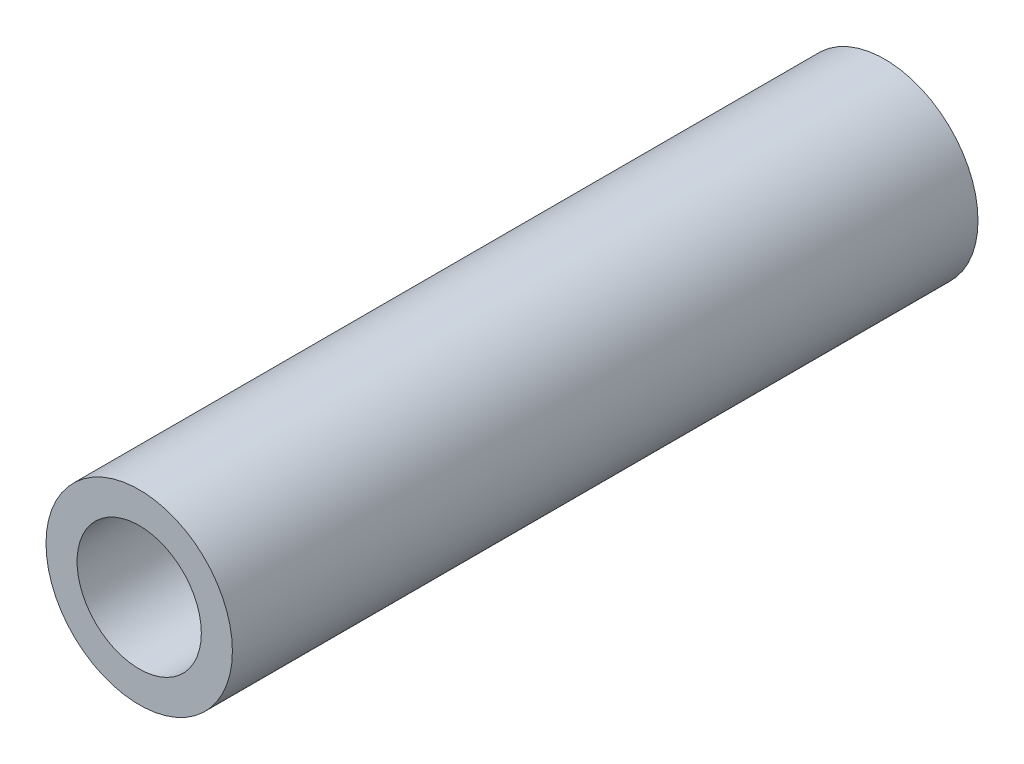
ISO-10303-21;
HEADER;
FILE_DESCRIPTION(('STEP AP214'),'2;1');
FILE_NAME('part.step','',(''),(''),'','','');
FILE_SCHEMA(('AUTOMOTIVE_DESIGN { 1 0 10303 214 1 1 1 1 }'));
ENDSEC;
DATA;
#1=APPLICATION_CONTEXT('core data for automotive mechanical design processes');
#2=APPLICATION_PROTOCOL_DEFINITION('international standard','automotive_design',2000,#1);
#3=PRODUCT_CONTEXT('',#1,'mechanical');
#4=PRODUCT('Part','Part','',(#3));
#5=PRODUCT_RELATED_PRODUCT_CATEGORY('part','',(#4));
#6=PRODUCT_DEFINITION_FORMATION('','',#4);
#7=PRODUCT_DEFINITION_CONTEXT('part definition',#1,'design');
#8=PRODUCT_DEFINITION('design','',#6,#7);
#9=PRODUCT_DEFINITION_SHAPE('','',#8);
#10=(LENGTH_UNIT() NAMED_UNIT(*) SI_UNIT(.MILLI.,.METRE.));
#11=(NAMED_UNIT(*) PLANE_ANGLE_UNIT() SI_UNIT($,.RADIAN.));
#12=(NAMED_UNIT(*) SI_UNIT($,.STERADIAN.) SOLID_ANGLE_UNIT());
#13=UNCERTAINTY_MEASURE_WITH_UNIT(LENGTH_MEASURE(1.E-05),#10,'distance_accuracy_value','');
#14=(GEOMETRIC_REPRESENTATION_CONTEXT(3) GLOBAL_UNCERTAINTY_ASSIGNED_CONTEXT((#13)) GLOBAL_UNIT_ASSIGNED_CONTEXT((#10,
#11,#12)) REPRESENTATION_CONTEXT('',''));
#15=CARTESIAN_POINT('',(0.,0.,0.));
#16=DIRECTION('',(0.,0.,1.));
#17=DIRECTION('',(1.,0.,0.));
#18=AXIS2_PLACEMENT_3D('',#15,#16,#17);
#19=CARTESIAN_POINT('',(0.,0.,24.));
#20=DIRECTION('',(0.,0.,1.));
#21=DIRECTION('',(1.,0.,0.));
#22=AXIS2_PLACEMENT_3D('',#19,#20,#21);
#23=PLANE('',#22);
#24=CARTESIAN_POINT('',(0.,0.,24.));
#25=DIRECTION('',(0.,0.,1.));
#26=DIRECTION('',(1.,0.,0.));
#27=AXIS2_PLACEMENT_3D('',#24,#25,#26);
#28=CIRCLE('',#27,3.);
#29=CARTESIAN_POINT('',(3.,0.,24.));
#30=VERTEX_POINT('',#29);
#31=EDGE_CURVE('E10',#30,#30,#28,.T.);
#32=ORIENTED_EDGE('',*,*,#31,.T.);
#33=EDGE_LOOP('',(#32));
#34=FACE_BOUND('',#33,.T.);
#35=CARTESIAN_POINT('',(0.,0.,24.));
#36=DIRECTION('',(0.,0.,1.));
#37=DIRECTION('',(1.,0.,0.));
#38=AXIS2_PLACEMENT_3D('',#35,#36,#37);
#39=CIRCLE('',#38,2.);
#40=CARTESIAN_POINT('',(2.,0.,24.));
#41=VERTEX_POINT('',#40);
#42=EDGE_CURVE('E41',#41,#41,#39,.T.);
#43=ORIENTED_EDGE('',*,*,#42,.F.);
#44=EDGE_LOOP('',(#43));
#45=FACE_BOUND('',#44,.T.);
#46=ADVANCED_FACE('F30',(#34,#45),#23,.T.);
#47=CARTESIAN_POINT('',(0.,0.,0.));
#48=DIRECTION('',(0.,0.,1.));
#49=DIRECTION('',(1.,0.,0.));
#50=AXIS2_PLACEMENT_3D('',#47,#48,#49);
#51=PLANE('',#50);
#52=CARTESIAN_POINT('',(0.,0.,0.));
#53=DIRECTION('',(0.,0.,1.));
#54=DIRECTION('',(1.,0.,0.));
#55=AXIS2_PLACEMENT_3D('',#52,#53,#54);
#56=CIRCLE('',#55,3.);
#57=CARTESIAN_POINT('',(3.,0.,0.));
#58=VERTEX_POINT('',#57);
#59=EDGE_CURVE('E34',#58,#58,#56,.T.);
#60=ORIENTED_EDGE('',*,*,#59,.F.);
#61=EDGE_LOOP('',(#60));
#62=FACE_BOUND('',#61,.T.);
#63=CARTESIAN_POINT('',(0.,0.,0.));
#64=DIRECTION('',(0.,0.,1.));
#65=DIRECTION('',(1.,0.,0.));
#66=AXIS2_PLACEMENT_3D('',#63,#64,#65);
#67=CIRCLE('',#66,2.);
#68=CARTESIAN_POINT('',(2.,0.,0.));
#69=VERTEX_POINT('',#68);
#70=EDGE_CURVE('E43',#69,#69,#67,.T.);
#71=ORIENTED_EDGE('',*,*,#70,.T.);
#72=EDGE_LOOP('',(#71));
#73=FACE_BOUND('',#72,.T.);
#74=ADVANCED_FACE('F53',(#62,#73),#51,.F.);
#75=CARTESIAN_POINT('',(0.,0.,24.));
#76=DIRECTION('',(0.,0.,-1.));
#77=DIRECTION('',(-1.,0.,0.));
#78=AXIS2_PLACEMENT_3D('',#75,#76,#77);
#79=CYLINDRICAL_SURFACE('',#78,3.);
#80=ORIENTED_EDGE('',*,*,#31,.F.);
#81=EDGE_LOOP('',(#80));
#82=FACE_BOUND('',#81,.T.);
#83=ORIENTED_EDGE('',*,*,#59,.T.);
#84=EDGE_LOOP('',(#83));
#85=FACE_BOUND('',#84,.T.);
#86=ADVANCED_FACE('F32',(#82,#85),#79,.T.);
#87=CARTESIAN_POINT('',(0.,0.,24.));
#88=DIRECTION('',(0.,0.,-1.));
#89=DIRECTION('',(-1.,0.,0.));
#90=AXIS2_PLACEMENT_3D('',#87,#88,#89);
#91=CYLINDRICAL_SURFACE('',#90,2.);
#92=ORIENTED_EDGE('',*,*,#42,.T.);
#93=EDGE_LOOP('',(#92));
#94=FACE_BOUND('',#93,.T.);
#95=ORIENTED_EDGE('',*,*,#70,.F.);
#96=EDGE_LOOP('',(#95));
#97=FACE_BOUND('',#96,.T.);
#98=ADVANCED_FACE('F49',(#94,#97),#91,.F.);
#99=CLOSED_SHELL('',(#46,#74,#86,#98));
#100=MANIFOLD_SOLID_BREP('B2',#99);
#101=ADVANCED_BREP_SHAPE_REPRESENTATION('',(#18,#100),#14);
#102=SHAPE_DEFINITION_REPRESENTATION(#9,#101);
ENDSEC;
END-ISO-10303-21;
